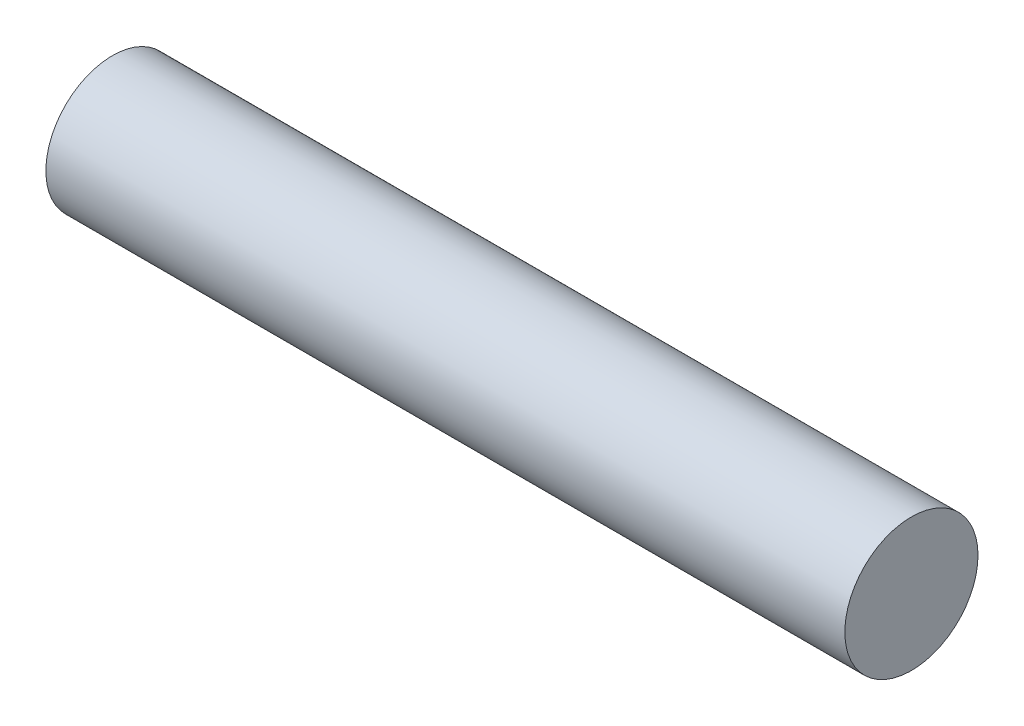
ISO-10303-21;
HEADER;
FILE_DESCRIPTION(('STEP AP214'),'2;1');
FILE_NAME('part.step','',(''),(''),'','','');
FILE_SCHEMA(('AUTOMOTIVE_DESIGN { 1 0 10303 214 1 1 1 1 }'));
ENDSEC;
DATA;
#1=APPLICATION_CONTEXT('core data for automotive mechanical design processes');
#2=APPLICATION_PROTOCOL_DEFINITION('international standard','automotive_design',2000,#1);
#3=PRODUCT_CONTEXT('',#1,'mechanical');
#4=PRODUCT('Part','Part','',(#3));
#5=PRODUCT_RELATED_PRODUCT_CATEGORY('part','',(#4));
#6=PRODUCT_DEFINITION_FORMATION('','',#4);
#7=PRODUCT_DEFINITION_CONTEXT('part definition',#1,'design');
#8=PRODUCT_DEFINITION('design','',#6,#7);
#9=PRODUCT_DEFINITION_SHAPE('','',#8);
#10=(LENGTH_UNIT() NAMED_UNIT(*) SI_UNIT(.MILLI.,.METRE.));
#11=(NAMED_UNIT(*) PLANE_ANGLE_UNIT() SI_UNIT($,.RADIAN.));
#12=(NAMED_UNIT(*) SI_UNIT($,.STERADIAN.) SOLID_ANGLE_UNIT());
#13=UNCERTAINTY_MEASURE_WITH_UNIT(LENGTH_MEASURE(1.E-05),#10,'distance_accuracy_value','');
#14=(GEOMETRIC_REPRESENTATION_CONTEXT(3) GLOBAL_UNCERTAINTY_ASSIGNED_CONTEXT((#13)) GLOBAL_UNIT_ASSIGNED_CONTEXT((#10,
#11,#12)) REPRESENTATION_CONTEXT('',''));
#15=CARTESIAN_POINT('',(0.,0.,0.));
#16=DIRECTION('',(0.,0.,1.));
#17=DIRECTION('',(1.,0.,0.));
#18=AXIS2_PLACEMENT_3D('',#15,#16,#17);
#19=CARTESIAN_POINT('',(24.,0.,0.));
#20=DIRECTION('',(-1.,0.,0.));
#21=DIRECTION('',(0.,0.,1.));
#22=AXIS2_PLACEMENT_3D('',#19,#20,#21);
#23=CYLINDRICAL_SURFACE('',#22,2.);
#24=CARTESIAN_POINT('',(24.,0.,0.));
#25=DIRECTION('',(1.,0.,0.));
#26=DIRECTION('',(0.,0.,-1.));
#27=AXIS2_PLACEMENT_3D('',#24,#25,#26);
#28=CIRCLE('',#27,2.);
#29=CARTESIAN_POINT('',(24.,0.,-2.));
#30=VERTEX_POINT('',#29);
#31=EDGE_CURVE('E10',#30,#30,#28,.T.);
#32=ORIENTED_EDGE('',*,*,#31,.F.);
#33=EDGE_LOOP('',(#32));
#34=FACE_BOUND('',#33,.T.);
#35=CARTESIAN_POINT('',(0.,0.,0.));
#36=DIRECTION('',(1.,0.,0.));
#37=DIRECTION('',(0.,0.,-1.));
#38=AXIS2_PLACEMENT_3D('',#35,#36,#37);
#39=CIRCLE('',#38,2.);
#40=CARTESIAN_POINT('',(0.,0.,-2.));
#41=VERTEX_POINT('',#40);
#42=EDGE_CURVE('E33',#41,#41,#39,.T.);
#43=ORIENTED_EDGE('',*,*,#42,.T.);
#44=EDGE_LOOP('',(#43));
#45=FACE_BOUND('',#44,.T.);
#46=ADVANCED_FACE('F30',(#34,#45),#23,.T.);
#47=CARTESIAN_POINT('',(24.,0.,0.));
#48=DIRECTION('',(1.,0.,0.));
#49=DIRECTION('',(0.,0.,-1.));
#50=AXIS2_PLACEMENT_3D('',#47,#48,#49);
#51=PLANE('',#50);
#52=ORIENTED_EDGE('',*,*,#31,.T.);
#53=EDGE_LOOP('',(#52));
#54=FACE_BOUND('',#53,.T.);
#55=ADVANCED_FACE('F45',(#54),#51,.T.);
#56=CARTESIAN_POINT('',(0.,0.,0.));
#57=DIRECTION('',(1.,0.,0.));
#58=DIRECTION('',(0.,0.,-1.));
#59=AXIS2_PLACEMENT_3D('',#56,#57,#58);
#60=PLANE('',#59);
#61=ORIENTED_EDGE('',*,*,#42,.F.);
#62=EDGE_LOOP('',(#61));
#63=FACE_BOUND('',#62,.T.);
#64=ADVANCED_FACE('F43',(#63),#60,.F.);
#65=CLOSED_SHELL('',(#46,#55,#64));
#66=MANIFOLD_SOLID_BREP('B2',#65);
#67=ADVANCED_BREP_SHAPE_REPRESENTATION('',(#18,#66),#14);
#68=SHAPE_DEFINITION_REPRESENTATION(#9,#67);
ENDSEC;
END-ISO-10303-21;
